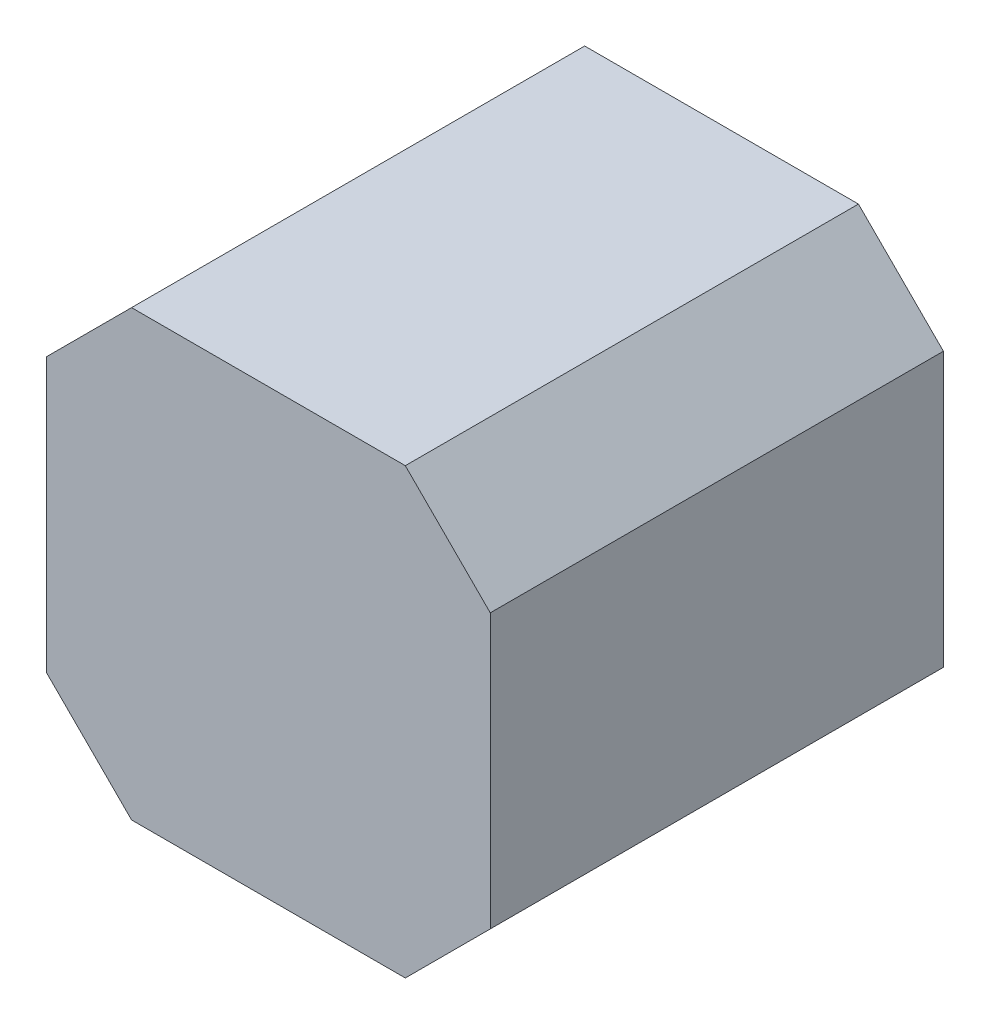
ISO-10303-21;
HEADER;
FILE_DESCRIPTION(('STEP AP214'),'2;1');
FILE_NAME('part.step','',(''),(''),'','','');
FILE_SCHEMA(('AUTOMOTIVE_DESIGN { 1 0 10303 214 1 1 1 1 }'));
ENDSEC;
DATA;
#1=APPLICATION_CONTEXT('core data for automotive mechanical design processes');
#2=APPLICATION_PROTOCOL_DEFINITION('international standard','automotive_design',2000,#1);
#3=PRODUCT_CONTEXT('',#1,'mechanical');
#4=PRODUCT('Part','Part','',(#3));
#5=PRODUCT_RELATED_PRODUCT_CATEGORY('part','',(#4));
#6=PRODUCT_DEFINITION_FORMATION('','',#4);
#7=PRODUCT_DEFINITION_CONTEXT('part definition',#1,'design');
#8=PRODUCT_DEFINITION('design','',#6,#7);
#9=PRODUCT_DEFINITION_SHAPE('','',#8);
#10=(LENGTH_UNIT() NAMED_UNIT(*) SI_UNIT(.MILLI.,.METRE.));
#11=(NAMED_UNIT(*) PLANE_ANGLE_UNIT() SI_UNIT($,.RADIAN.));
#12=(NAMED_UNIT(*) SI_UNIT($,.STERADIAN.) SOLID_ANGLE_UNIT());
#13=UNCERTAINTY_MEASURE_WITH_UNIT(LENGTH_MEASURE(1.E-05),#10,'distance_accuracy_value','');
#14=(GEOMETRIC_REPRESENTATION_CONTEXT(3) GLOBAL_UNCERTAINTY_ASSIGNED_CONTEXT((#13)) GLOBAL_UNIT_ASSIGNED_CONTEXT((#10,
#11,#12)) REPRESENTATION_CONTEXT('',''));
#15=CARTESIAN_POINT('',(0.,0.,0.));
#16=DIRECTION('',(0.,0.,1.));
#17=DIRECTION('',(1.,0.,0.));
#18=AXIS2_PLACEMENT_3D('',#15,#16,#17);
#19=CARTESIAN_POINT('',(-2.35,2.35,2.4));
#20=DIRECTION('',(1.,0.,0.));
#21=DIRECTION('',(0.,0.,-1.));
#22=AXIS2_PLACEMENT_3D('',#19,#20,#21);
#23=PLANE('',#22);
#24=DIRECTION('',(0.,-1.,0.));
#25=VECTOR('',#24,1.);
#26=CARTESIAN_POINT('',(-2.35,2.35,0.));
#27=LINE('',#26,#25);
#28=CARTESIAN_POINT('',(-2.35,1.9,0.));
#29=VERTEX_POINT('',#28);
#30=CARTESIAN_POINT('',(-2.35,0.450000000000002,0.));
#31=VERTEX_POINT('',#30);
#32=EDGE_CURVE('E11',#29,#31,#27,.T.);
#33=ORIENTED_EDGE('',*,*,#32,.T.);
#34=DIRECTION('',(0.,0.,1.));
#35=VECTOR('',#34,1.);
#36=CARTESIAN_POINT('',(-2.35,0.450000000000002,2.4));
#37=LINE('',#36,#35);
#38=CARTESIAN_POINT('',(-2.35,0.450000000000002,2.4));
#39=VERTEX_POINT('',#38);
#40=EDGE_CURVE('E23',#31,#39,#37,.T.);
#41=ORIENTED_EDGE('',*,*,#40,.T.);
#42=DIRECTION('',(0.,-1.,0.));
#43=VECTOR('',#42,1.);
#44=CARTESIAN_POINT('',(-2.35,2.35,2.4));
#45=LINE('',#44,#43);
#46=CARTESIAN_POINT('',(-2.35,1.9,2.4));
#47=VERTEX_POINT('',#46);
#48=EDGE_CURVE('E131',#47,#39,#45,.T.);
#49=ORIENTED_EDGE('',*,*,#48,.F.);
#50=DIRECTION('',(0.,0.,-1.));
#51=VECTOR('',#50,1.);
#52=CARTESIAN_POINT('',(-2.35,1.9,2.4));
#53=LINE('',#52,#51);
#54=EDGE_CURVE('E129',#47,#29,#53,.T.);
#55=ORIENTED_EDGE('',*,*,#54,.T.);
#56=EDGE_LOOP('',(#33,#41,#49,#55));
#57=FACE_BOUND('',#56,.T.);
#58=ADVANCED_FACE('F16',(#57),#23,.F.);
#59=CARTESIAN_POINT('',(-2.35,0.,2.4));
#60=DIRECTION('',(0.,1.,0.));
#61=DIRECTION('',(0.,0.,1.));
#62=AXIS2_PLACEMENT_3D('',#59,#60,#61);
#63=PLANE('',#62);
#64=DIRECTION('',(1.,0.,0.));
#65=VECTOR('',#64,1.);
#66=CARTESIAN_POINT('',(-2.35,0.,0.));
#67=LINE('',#66,#65);
#68=CARTESIAN_POINT('',(-1.9,0.,0.));
#69=VERTEX_POINT('',#68);
#70=CARTESIAN_POINT('',(-0.450000000000002,0.,0.));
#71=VERTEX_POINT('',#70);
#72=EDGE_CURVE('E127',#69,#71,#67,.T.);
#73=ORIENTED_EDGE('',*,*,#72,.T.);
#74=DIRECTION('',(0.,0.,1.));
#75=VECTOR('',#74,1.);
#76=CARTESIAN_POINT('',(-0.450000000000002,0.,2.4));
#77=LINE('',#76,#75);
#78=CARTESIAN_POINT('',(-0.450000000000002,0.,2.4));
#79=VERTEX_POINT('',#78);
#80=EDGE_CURVE('E125',#71,#79,#77,.T.);
#81=ORIENTED_EDGE('',*,*,#80,.T.);
#82=DIRECTION('',(1.,0.,0.));
#83=VECTOR('',#82,1.);
#84=CARTESIAN_POINT('',(-2.35,0.,2.4));
#85=LINE('',#84,#83);
#86=CARTESIAN_POINT('',(-1.9,0.,2.4));
#87=VERTEX_POINT('',#86);
#88=EDGE_CURVE('E123',#87,#79,#85,.T.);
#89=ORIENTED_EDGE('',*,*,#88,.F.);
#90=DIRECTION('',(0.,0.,-1.));
#91=VECTOR('',#90,1.);
#92=CARTESIAN_POINT('',(-1.9,0.,2.4));
#93=LINE('',#92,#91);
#94=EDGE_CURVE('E120',#87,#69,#93,.T.);
#95=ORIENTED_EDGE('',*,*,#94,.T.);
#96=EDGE_LOOP('',(#73,#81,#89,#95));
#97=FACE_BOUND('',#96,.T.);
#98=ADVANCED_FACE('F165',(#97),#63,.F.);
#99=CARTESIAN_POINT('',(0.,2.35,2.4));
#100=DIRECTION('',(-1.,0.,0.));
#101=DIRECTION('',(0.,0.,1.));
#102=AXIS2_PLACEMENT_3D('',#99,#100,#101);
#103=PLANE('',#102);
#104=DIRECTION('',(0.,1.,0.));
#105=VECTOR('',#104,1.);
#106=CARTESIAN_POINT('',(0.,2.35,2.4));
#107=LINE('',#106,#105);
#108=CARTESIAN_POINT('',(0.,0.450000000000001,2.4));
#109=VERTEX_POINT('',#108);
#110=CARTESIAN_POINT('',(0.,1.9,2.4));
#111=VERTEX_POINT('',#110);
#112=EDGE_CURVE('E101',#109,#111,#107,.T.);
#113=ORIENTED_EDGE('',*,*,#112,.F.);
#114=DIRECTION('',(0.,0.,-1.));
#115=VECTOR('',#114,1.);
#116=CARTESIAN_POINT('',(0.,0.45,2.4));
#117=LINE('',#116,#115);
#118=CARTESIAN_POINT('',(0.,0.450000000000001,0.));
#119=VERTEX_POINT('',#118);
#120=EDGE_CURVE('E117',#109,#119,#117,.T.);
#121=ORIENTED_EDGE('',*,*,#120,.T.);
#122=DIRECTION('',(0.,1.,0.));
#123=VECTOR('',#122,1.);
#124=CARTESIAN_POINT('',(0.,2.35,0.));
#125=LINE('',#124,#123);
#126=CARTESIAN_POINT('',(0.,1.9,0.));
#127=VERTEX_POINT('',#126);
#128=EDGE_CURVE('E115',#119,#127,#125,.T.);
#129=ORIENTED_EDGE('',*,*,#128,.T.);
#130=DIRECTION('',(0.,0.,1.));
#131=VECTOR('',#130,1.);
#132=CARTESIAN_POINT('',(0.,1.9,2.4));
#133=LINE('',#132,#131);
#134=EDGE_CURVE('E113',#127,#111,#133,.T.);
#135=ORIENTED_EDGE('',*,*,#134,.T.);
#136=EDGE_LOOP('',(#113,#121,#129,#135));
#137=FACE_BOUND('',#136,.T.);
#138=ADVANCED_FACE('F169',(#137),#103,.F.);
#139=CARTESIAN_POINT('',(-2.35,2.35,2.4));
#140=DIRECTION('',(0.,-1.,0.));
#141=DIRECTION('',(1.,0.,0.));
#142=AXIS2_PLACEMENT_3D('',#139,#140,#141);
#143=PLANE('',#142);
#144=DIRECTION('',(-1.,0.,0.));
#145=VECTOR('',#144,1.);
#146=CARTESIAN_POINT('',(-2.35,2.35,0.));
#147=LINE('',#146,#145);
#148=CARTESIAN_POINT('',(-0.45,2.35,0.));
#149=VERTEX_POINT('',#148);
#150=CARTESIAN_POINT('',(-1.9,2.35,0.));
#151=VERTEX_POINT('',#150);
#152=EDGE_CURVE('E111',#149,#151,#147,.T.);
#153=ORIENTED_EDGE('',*,*,#152,.T.);
#154=DIRECTION('',(0.,0.,1.));
#155=VECTOR('',#154,1.);
#156=CARTESIAN_POINT('',(-1.9,2.35,2.4));
#157=LINE('',#156,#155);
#158=CARTESIAN_POINT('',(-1.9,2.35,2.4));
#159=VERTEX_POINT('',#158);
#160=EDGE_CURVE('E83',#151,#159,#157,.T.);
#161=ORIENTED_EDGE('',*,*,#160,.T.);
#162=DIRECTION('',(-1.,0.,0.));
#163=VECTOR('',#162,1.);
#164=CARTESIAN_POINT('',(-2.35,2.35,2.4));
#165=LINE('',#164,#163);
#166=CARTESIAN_POINT('',(-0.450000000000001,2.35,2.4));
#167=VERTEX_POINT('',#166);
#168=EDGE_CURVE('E77',#167,#159,#165,.T.);
#169=ORIENTED_EDGE('',*,*,#168,.F.);
#170=DIRECTION('',(0.,0.,-1.));
#171=VECTOR('',#170,1.);
#172=CARTESIAN_POINT('',(-0.45,2.35,2.4));
#173=LINE('',#172,#171);
#174=EDGE_CURVE('E80',#167,#149,#173,.T.);
#175=ORIENTED_EDGE('',*,*,#174,.T.);
#176=EDGE_LOOP('',(#153,#161,#169,#175));
#177=FACE_BOUND('',#176,.T.);
#178=ADVANCED_FACE('F79',(#177),#143,.F.);
#179=CARTESIAN_POINT('',(-2.35,0.,2.4));
#180=DIRECTION('',(0.,0.,1.));
#181=DIRECTION('',(1.,0.,0.));
#182=AXIS2_PLACEMENT_3D('',#179,#180,#181);
#183=PLANE('',#182);
#184=ORIENTED_EDGE('',*,*,#88,.T.);
#185=DIRECTION('',(0.707106781186549,0.707106781186546,0.));
#186=VECTOR('',#185,1.);
#187=CARTESIAN_POINT('',(-1.40000000000001,-0.95,2.4));
#188=LINE('',#187,#186);
#189=EDGE_CURVE('E96',#79,#109,#188,.T.);
#190=ORIENTED_EDGE('',*,*,#189,.T.);
#191=ORIENTED_EDGE('',*,*,#112,.T.);
#192=DIRECTION('',(-0.707106781186546,0.707106781186549,0.));
#193=VECTOR('',#192,1.);
#194=CARTESIAN_POINT('',(-0.224999999999998,2.125,2.4));
#195=LINE('',#194,#193);
#196=EDGE_CURVE('E93',#111,#167,#195,.T.);
#197=ORIENTED_EDGE('',*,*,#196,.T.);
#198=ORIENTED_EDGE('',*,*,#168,.T.);
#199=DIRECTION('',(-0.707106781186549,-0.707106781186546,0.));
#200=VECTOR('',#199,1.);
#201=CARTESIAN_POINT('',(-3.3,0.950000000000004,2.4));
#202=LINE('',#201,#200);
#203=EDGE_CURVE('E103',#159,#47,#202,.T.);
#204=ORIENTED_EDGE('',*,*,#203,.T.);
#205=ORIENTED_EDGE('',*,*,#48,.T.);
#206=DIRECTION('',(0.707106781186546,-0.707106781186549,0.));
#207=VECTOR('',#206,1.);
#208=CARTESIAN_POINT('',(-2.125,0.225,2.4));
#209=LINE('',#208,#207);
#210=EDGE_CURVE('E106',#39,#87,#209,.T.);
#211=ORIENTED_EDGE('',*,*,#210,.T.);
#212=EDGE_LOOP('',(#184,#190,#191,#197,#198,#204,#205,#211));
#213=FACE_BOUND('',#212,.T.);
#214=ADVANCED_FACE('F99',(#213),#183,.T.);
#215=CARTESIAN_POINT('',(-2.35,0.,0.));
#216=DIRECTION('',(0.,0.,1.));
#217=DIRECTION('',(1.,0.,0.));
#218=AXIS2_PLACEMENT_3D('',#215,#216,#217);
#219=PLANE('',#218);
#220=ORIENTED_EDGE('',*,*,#128,.F.);
#221=DIRECTION('',(-0.707106781186549,-0.707106781186546,0.));
#222=VECTOR('',#221,1.);
#223=CARTESIAN_POINT('',(0.,0.45,0.));
#224=LINE('',#223,#222);
#225=EDGE_CURVE('E140',#119,#71,#224,.T.);
#226=ORIENTED_EDGE('',*,*,#225,.T.);
#227=ORIENTED_EDGE('',*,*,#72,.F.);
#228=DIRECTION('',(-0.707106781186546,0.707106781186549,0.));
#229=VECTOR('',#228,1.);
#230=CARTESIAN_POINT('',(-1.9,0.,0.));
#231=LINE('',#230,#229);
#232=EDGE_CURVE('E142',#69,#31,#231,.T.);
#233=ORIENTED_EDGE('',*,*,#232,.T.);
#234=ORIENTED_EDGE('',*,*,#32,.F.);
#235=DIRECTION('',(0.707106781186549,0.707106781186546,0.));
#236=VECTOR('',#235,1.);
#237=CARTESIAN_POINT('',(-2.35,1.9,0.));
#238=LINE('',#237,#236);
#239=EDGE_CURVE('E146',#29,#151,#238,.T.);
#240=ORIENTED_EDGE('',*,*,#239,.T.);
#241=ORIENTED_EDGE('',*,*,#152,.F.);
#242=DIRECTION('',(0.707106781186546,-0.707106781186549,0.));
#243=VECTOR('',#242,1.);
#244=CARTESIAN_POINT('',(-0.45,2.35,0.));
#245=LINE('',#244,#243);
#246=EDGE_CURVE('E95',#149,#127,#245,.T.);
#247=ORIENTED_EDGE('',*,*,#246,.T.);
#248=EDGE_LOOP('',(#220,#226,#227,#233,#234,#240,#241,#247));
#249=FACE_BOUND('',#248,.T.);
#250=ADVANCED_FACE('F149',(#249),#219,.F.);
#251=CARTESIAN_POINT('',(0.,0.45,2.4));
#252=DIRECTION('',(-0.707106781186546,0.707106781186549,0.));
#253=DIRECTION('',(-0.707106781186549,-0.707106781186546,0.));
#254=AXIS2_PLACEMENT_3D('',#251,#252,#253);
#255=PLANE('',#254);
#256=ORIENTED_EDGE('',*,*,#189,.F.);
#257=ORIENTED_EDGE('',*,*,#80,.F.);
#258=ORIENTED_EDGE('',*,*,#225,.F.);
#259=ORIENTED_EDGE('',*,*,#120,.F.);
#260=EDGE_LOOP('',(#256,#257,#258,#259));
#261=FACE_BOUND('',#260,.T.);
#262=ADVANCED_FACE('F162',(#261),#255,.F.);
#263=CARTESIAN_POINT('',(-1.9,0.,2.4));
#264=DIRECTION('',(0.707106781186549,0.707106781186546,0.));
#265=DIRECTION('',(-0.707106781186546,0.707106781186549,0.));
#266=AXIS2_PLACEMENT_3D('',#263,#264,#265);
#267=PLANE('',#266);
#268=ORIENTED_EDGE('',*,*,#210,.F.);
#269=ORIENTED_EDGE('',*,*,#40,.F.);
#270=ORIENTED_EDGE('',*,*,#232,.F.);
#271=ORIENTED_EDGE('',*,*,#94,.F.);
#272=EDGE_LOOP('',(#268,#269,#270,#271));
#273=FACE_BOUND('',#272,.T.);
#274=ADVANCED_FACE('F139',(#273),#267,.F.);
#275=CARTESIAN_POINT('',(-2.35,1.9,2.4));
#276=DIRECTION('',(0.707106781186546,-0.707106781186549,0.));
#277=DIRECTION('',(0.707106781186549,0.707106781186546,0.));
#278=AXIS2_PLACEMENT_3D('',#275,#276,#277);
#279=PLANE('',#278);
#280=ORIENTED_EDGE('',*,*,#203,.F.);
#281=ORIENTED_EDGE('',*,*,#160,.F.);
#282=ORIENTED_EDGE('',*,*,#239,.F.);
#283=ORIENTED_EDGE('',*,*,#54,.F.);
#284=EDGE_LOOP('',(#280,#281,#282,#283));
#285=FACE_BOUND('',#284,.T.);
#286=ADVANCED_FACE('F153',(#285),#279,.F.);
#287=CARTESIAN_POINT('',(-0.45,2.35,2.4));
#288=DIRECTION('',(-0.707106781186549,-0.707106781186546,0.));
#289=DIRECTION('',(0.707106781186546,-0.707106781186549,0.));
#290=AXIS2_PLACEMENT_3D('',#287,#288,#289);
#291=PLANE('',#290);
#292=ORIENTED_EDGE('',*,*,#196,.F.);
#293=ORIENTED_EDGE('',*,*,#134,.F.);
#294=ORIENTED_EDGE('',*,*,#246,.F.);
#295=ORIENTED_EDGE('',*,*,#174,.F.);
#296=EDGE_LOOP('',(#292,#293,#294,#295));
#297=FACE_BOUND('',#296,.T.);
#298=ADVANCED_FACE('F91',(#297),#291,.F.);
#299=CLOSED_SHELL('',(#58,#98,#138,#178,#214,#250,#262,#274,#286,#298));
#300=MANIFOLD_SOLID_BREP('B1',#299);
#301=ADVANCED_BREP_SHAPE_REPRESENTATION('',(#18,#300),#14);
#302=SHAPE_DEFINITION_REPRESENTATION(#9,#301);
ENDSEC;
END-ISO-10303-21;
